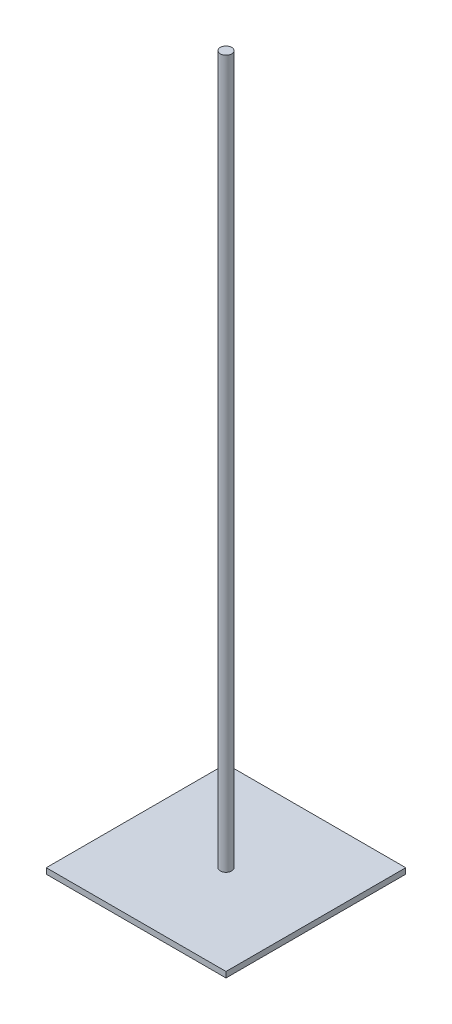
ISO-10303-21;
HEADER;
FILE_DESCRIPTION(('STEP AP214'),'2;1');
FILE_NAME('part.step','',(''),(''),'','','');
FILE_SCHEMA(('AUTOMOTIVE_DESIGN { 1 0 10303 214 1 1 1 1 }'));
ENDSEC;
DATA;
#1=APPLICATION_CONTEXT('core data for automotive mechanical design processes');
#2=APPLICATION_PROTOCOL_DEFINITION('international standard','automotive_design',2000,#1);
#3=PRODUCT_CONTEXT('',#1,'mechanical');
#4=PRODUCT('Part','Part','',(#3));
#5=PRODUCT_RELATED_PRODUCT_CATEGORY('part','',(#4));
#6=PRODUCT_DEFINITION_FORMATION('','',#4);
#7=PRODUCT_DEFINITION_CONTEXT('part definition',#1,'design');
#8=PRODUCT_DEFINITION('design','',#6,#7);
#9=PRODUCT_DEFINITION_SHAPE('','',#8);
#10=(LENGTH_UNIT() NAMED_UNIT(*) SI_UNIT(.MILLI.,.METRE.));
#11=(NAMED_UNIT(*) PLANE_ANGLE_UNIT() SI_UNIT($,.RADIAN.));
#12=(NAMED_UNIT(*) SI_UNIT($,.STERADIAN.) SOLID_ANGLE_UNIT());
#13=UNCERTAINTY_MEASURE_WITH_UNIT(LENGTH_MEASURE(1.E-05),#10,'distance_accuracy_value','');
#14=(GEOMETRIC_REPRESENTATION_CONTEXT(3) GLOBAL_UNCERTAINTY_ASSIGNED_CONTEXT((#13)) GLOBAL_UNIT_ASSIGNED_CONTEXT((#10,
#11,#12)) REPRESENTATION_CONTEXT('',''));
#15=CARTESIAN_POINT('',(0.,0.,0.));
#16=DIRECTION('',(0.,0.,1.));
#17=DIRECTION('',(1.,0.,0.));
#18=AXIS2_PLACEMENT_3D('',#15,#16,#17);
#19=CARTESIAN_POINT('',(-63.5,504.,63.5));
#20=DIRECTION('',(0.,-1.,0.));
#21=DIRECTION('',(0.,0.,-1.));
#22=AXIS2_PLACEMENT_3D('',#19,#20,#21);
#23=CYLINDRICAL_SURFACE('',#22,4.);
#24=CARTESIAN_POINT('',(-63.5,504.,63.5));
#25=DIRECTION('',(0.,1.,0.));
#26=DIRECTION('',(0.,0.,1.));
#27=AXIS2_PLACEMENT_3D('',#24,#25,#26);
#28=CIRCLE('',#27,4.);
#29=CARTESIAN_POINT('',(-63.5,504.,67.5));
#30=VERTEX_POINT('',#29);
#31=EDGE_CURVE('E11',#30,#30,#28,.T.);
#32=ORIENTED_EDGE('',*,*,#31,.F.);
#33=EDGE_LOOP('',(#32));
#34=FACE_BOUND('',#33,.T.);
#35=CARTESIAN_POINT('',(-63.5,4.,63.5));
#36=DIRECTION('',(0.,1.,0.));
#37=DIRECTION('',(0.,0.,1.));
#38=AXIS2_PLACEMENT_3D('',#35,#36,#37);
#39=CIRCLE('',#38,4.);
#40=CARTESIAN_POINT('',(-63.5,4.,67.5));
#41=VERTEX_POINT('',#40);
#42=EDGE_CURVE('E58',#41,#41,#39,.T.);
#43=ORIENTED_EDGE('',*,*,#42,.T.);
#44=EDGE_LOOP('',(#43));
#45=FACE_BOUND('',#44,.T.);
#46=ADVANCED_FACE('F55',(#34,#45),#23,.T.);
#47=CARTESIAN_POINT('',(-63.5,504.,63.5));
#48=DIRECTION('',(0.,1.,0.));
#49=DIRECTION('',(0.,0.,1.));
#50=AXIS2_PLACEMENT_3D('',#47,#48,#49);
#51=PLANE('',#50);
#52=ORIENTED_EDGE('',*,*,#31,.T.);
#53=EDGE_LOOP('',(#52));
#54=FACE_BOUND('',#53,.T.);
#55=ADVANCED_FACE('F70',(#54),#51,.T.);
#56=CARTESIAN_POINT('',(-63.5,4.,63.5));
#57=DIRECTION('',(0.,1.,0.));
#58=DIRECTION('',(0.,0.,1.));
#59=AXIS2_PLACEMENT_3D('',#56,#57,#58);
#60=PLANE('',#59);
#61=ORIENTED_EDGE('',*,*,#42,.F.);
#62=EDGE_LOOP('',(#61));
#63=FACE_BOUND('',#62,.T.);
#64=ADVANCED_FACE('F68',(#63),#60,.F.);
#65=CLOSED_SHELL('',(#46,#55,#64));
#66=MANIFOLD_SOLID_BREP('B2',#65);
#67=CARTESIAN_POINT('',(0.,4.,0.));
#68=DIRECTION('',(-1.,0.,0.));
#69=DIRECTION('',(0.,0.,1.));
#70=AXIS2_PLACEMENT_3D('',#67,#68,#69);
#71=PLANE('',#70);
#72=DIRECTION('',(0.,0.,-1.));
#73=VECTOR('',#72,1.);
#74=CARTESIAN_POINT('',(0.,0.,0.));
#75=LINE('',#74,#73);
#76=CARTESIAN_POINT('',(0.,0.,127.));
#77=VERTEX_POINT('',#76);
#78=CARTESIAN_POINT('',(0.,0.,0.));
#79=VERTEX_POINT('',#78);
#80=EDGE_CURVE('E172',#77,#79,#75,.T.);
#81=ORIENTED_EDGE('',*,*,#80,.T.);
#82=DIRECTION('',(0.,-1.,0.));
#83=VECTOR('',#82,1.);
#84=CARTESIAN_POINT('',(0.,4.,0.));
#85=LINE('',#84,#83);
#86=CARTESIAN_POINT('',(0.,4.,0.));
#87=VERTEX_POINT('',#86);
#88=EDGE_CURVE('E53',#87,#79,#85,.T.);
#89=ORIENTED_EDGE('',*,*,#88,.F.);
#90=DIRECTION('',(0.,0.,-1.));
#91=VECTOR('',#90,1.);
#92=CARTESIAN_POINT('',(0.,4.,0.));
#93=LINE('',#92,#91);
#94=CARTESIAN_POINT('',(0.,4.,127.));
#95=VERTEX_POINT('',#94);
#96=EDGE_CURVE('E156',#95,#87,#93,.T.);
#97=ORIENTED_EDGE('',*,*,#96,.F.);
#98=DIRECTION('',(0.,-1.,0.));
#99=VECTOR('',#98,1.);
#100=CARTESIAN_POINT('',(0.,4.,127.));
#101=LINE('',#100,#99);
#102=EDGE_CURVE('E168',#95,#77,#101,.T.);
#103=ORIENTED_EDGE('',*,*,#102,.T.);
#104=EDGE_LOOP('',(#81,#89,#97,#103));
#105=FACE_BOUND('',#104,.T.);
#106=ADVANCED_FACE('F102',(#105),#71,.F.);
#107=CARTESIAN_POINT('',(0.,4.,0.));
#108=DIRECTION('',(0.,0.,1.));
#109=DIRECTION('',(1.,0.,0.));
#110=AXIS2_PLACEMENT_3D('',#107,#108,#109);
#111=PLANE('',#110);
#112=DIRECTION('',(-1.,0.,0.));
#113=VECTOR('',#112,1.);
#114=CARTESIAN_POINT('',(0.,0.,0.));
#115=LINE('',#114,#113);
#116=CARTESIAN_POINT('',(-127.,0.,0.));
#117=VERTEX_POINT('',#116);
#118=EDGE_CURVE('E161',#79,#117,#115,.T.);
#119=ORIENTED_EDGE('',*,*,#118,.T.);
#120=DIRECTION('',(0.,-1.,0.));
#121=VECTOR('',#120,1.);
#122=CARTESIAN_POINT('',(-127.,4.,0.));
#123=LINE('',#122,#121);
#124=CARTESIAN_POINT('',(-127.,4.,0.));
#125=VERTEX_POINT('',#124);
#126=EDGE_CURVE('E111',#125,#117,#123,.T.);
#127=ORIENTED_EDGE('',*,*,#126,.F.);
#128=DIRECTION('',(-1.,0.,0.));
#129=VECTOR('',#128,1.);
#130=CARTESIAN_POINT('',(0.,4.,0.));
#131=LINE('',#130,#129);
#132=EDGE_CURVE('E151',#87,#125,#131,.T.);
#133=ORIENTED_EDGE('',*,*,#132,.F.);
#134=ORIENTED_EDGE('',*,*,#88,.T.);
#135=EDGE_LOOP('',(#119,#127,#133,#134));
#136=FACE_BOUND('',#135,.T.);
#137=ADVANCED_FACE('F160',(#136),#111,.F.);
#138=CARTESIAN_POINT('',(-127.,4.,0.));
#139=DIRECTION('',(1.,0.,0.));
#140=DIRECTION('',(0.,0.,-1.));
#141=AXIS2_PLACEMENT_3D('',#138,#139,#140);
#142=PLANE('',#141);
#143=DIRECTION('',(0.,0.,1.));
#144=VECTOR('',#143,1.);
#145=CARTESIAN_POINT('',(-127.,0.,0.));
#146=LINE('',#145,#144);
#147=CARTESIAN_POINT('',(-127.,0.,127.));
#148=VERTEX_POINT('',#147);
#149=EDGE_CURVE('E137',#117,#148,#146,.T.);
#150=ORIENTED_EDGE('',*,*,#149,.T.);
#151=DIRECTION('',(0.,-1.,0.));
#152=VECTOR('',#151,1.);
#153=CARTESIAN_POINT('',(-127.,4.,127.));
#154=LINE('',#153,#152);
#155=CARTESIAN_POINT('',(-127.,4.,127.));
#156=VERTEX_POINT('',#155);
#157=EDGE_CURVE('E163',#156,#148,#154,.T.);
#158=ORIENTED_EDGE('',*,*,#157,.F.);
#159=DIRECTION('',(0.,0.,1.));
#160=VECTOR('',#159,1.);
#161=CARTESIAN_POINT('',(-127.,4.,0.));
#162=LINE('',#161,#160);
#163=EDGE_CURVE('E154',#125,#156,#162,.T.);
#164=ORIENTED_EDGE('',*,*,#163,.F.);
#165=ORIENTED_EDGE('',*,*,#126,.T.);
#166=EDGE_LOOP('',(#150,#158,#164,#165));
#167=FACE_BOUND('',#166,.T.);
#168=ADVANCED_FACE('F164',(#167),#142,.F.);
#169=CARTESIAN_POINT('',(0.,4.,127.));
#170=DIRECTION('',(0.,0.,-1.));
#171=DIRECTION('',(-1.,0.,0.));
#172=AXIS2_PLACEMENT_3D('',#169,#170,#171);
#173=PLANE('',#172);
#174=DIRECTION('',(1.,0.,0.));
#175=VECTOR('',#174,1.);
#176=CARTESIAN_POINT('',(0.,0.,127.));
#177=LINE('',#176,#175);
#178=EDGE_CURVE('E143',#148,#77,#177,.T.);
#179=ORIENTED_EDGE('',*,*,#178,.T.);
#180=ORIENTED_EDGE('',*,*,#102,.F.);
#181=DIRECTION('',(1.,0.,0.));
#182=VECTOR('',#181,1.);
#183=CARTESIAN_POINT('',(0.,4.,127.));
#184=LINE('',#183,#182);
#185=EDGE_CURVE('E119',#156,#95,#184,.T.);
#186=ORIENTED_EDGE('',*,*,#185,.F.);
#187=ORIENTED_EDGE('',*,*,#157,.T.);
#188=EDGE_LOOP('',(#179,#180,#186,#187));
#189=FACE_BOUND('',#188,.T.);
#190=ADVANCED_FACE('F185',(#189),#173,.F.);
#191=CARTESIAN_POINT('',(0.,4.,0.));
#192=DIRECTION('',(0.,-1.,0.));
#193=DIRECTION('',(0.,0.,-1.));
#194=AXIS2_PLACEMENT_3D('',#191,#192,#193);
#195=PLANE('',#194);
#196=ORIENTED_EDGE('',*,*,#96,.T.);
#197=ORIENTED_EDGE('',*,*,#132,.T.);
#198=ORIENTED_EDGE('',*,*,#163,.T.);
#199=ORIENTED_EDGE('',*,*,#185,.T.);
#200=EDGE_LOOP('',(#196,#197,#198,#199));
#201=FACE_BOUND('',#200,.T.);
#202=ADVANCED_FACE('F152',(#201),#195,.F.);
#203=CARTESIAN_POINT('',(0.,0.,0.));
#204=DIRECTION('',(0.,-1.,0.));
#205=DIRECTION('',(0.,0.,-1.));
#206=AXIS2_PLACEMENT_3D('',#203,#204,#205);
#207=PLANE('',#206);
#208=ORIENTED_EDGE('',*,*,#80,.F.);
#209=ORIENTED_EDGE('',*,*,#178,.F.);
#210=ORIENTED_EDGE('',*,*,#149,.F.);
#211=ORIENTED_EDGE('',*,*,#118,.F.);
#212=EDGE_LOOP('',(#208,#209,#210,#211));
#213=FACE_BOUND('',#212,.T.);
#214=ADVANCED_FACE('F188',(#213),#207,.T.);
#215=CLOSED_SHELL('',(#106,#137,#168,#190,#202,#214));
#216=MANIFOLD_SOLID_BREP('B6',#215);
#217=ADVANCED_BREP_SHAPE_REPRESENTATION('',(#18,#66,#216),#14);
#218=SHAPE_DEFINITION_REPRESENTATION(#9,#217);
ENDSEC;
END-ISO-10303-21;
